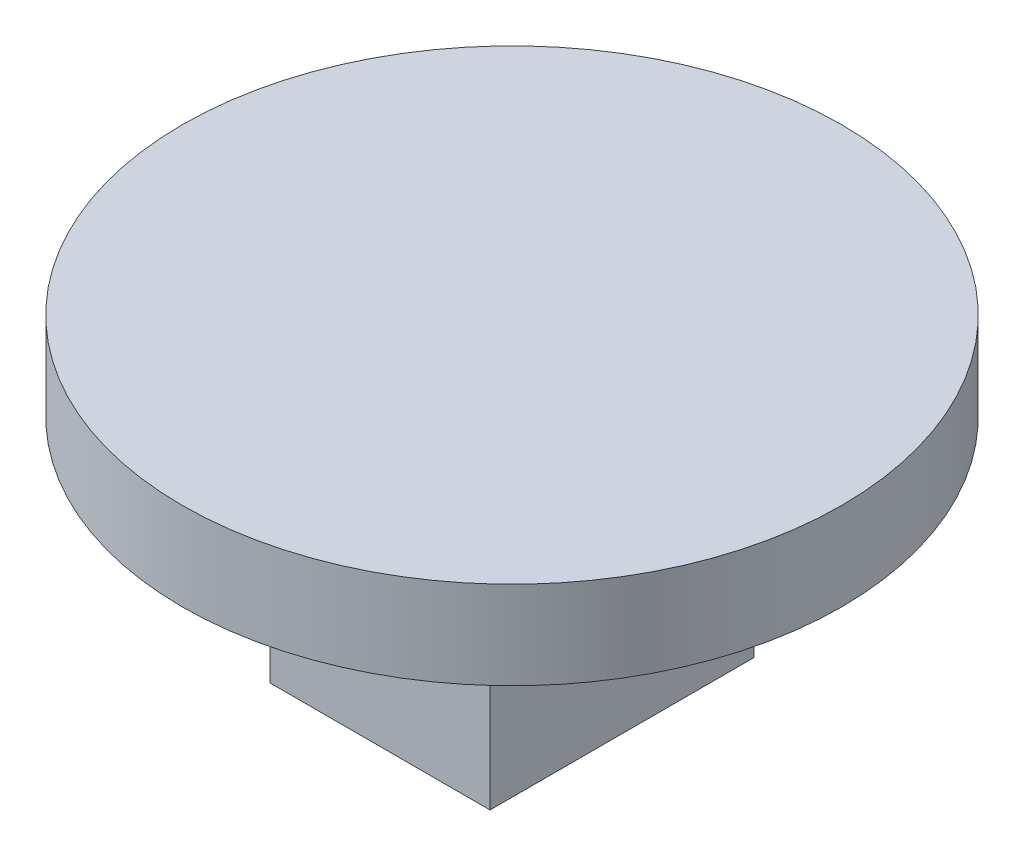
ISO-10303-21;
HEADER;
FILE_DESCRIPTION(('STEP AP214'),'2;1');
FILE_NAME('part.step','',(''),(''),'','','');
FILE_SCHEMA(('AUTOMOTIVE_DESIGN { 1 0 10303 214 1 1 1 1 }'));
ENDSEC;
DATA;
#1=APPLICATION_CONTEXT('core data for automotive mechanical design processes');
#2=APPLICATION_PROTOCOL_DEFINITION('international standard','automotive_design',2000,#1);
#3=PRODUCT_CONTEXT('',#1,'mechanical');
#4=PRODUCT('Part','Part','',(#3));
#5=PRODUCT_RELATED_PRODUCT_CATEGORY('part','',(#4));
#6=PRODUCT_DEFINITION_FORMATION('','',#4);
#7=PRODUCT_DEFINITION_CONTEXT('part definition',#1,'design');
#8=PRODUCT_DEFINITION('design','',#6,#7);
#9=PRODUCT_DEFINITION_SHAPE('','',#8);
#10=(LENGTH_UNIT() NAMED_UNIT(*) SI_UNIT(.MILLI.,.METRE.));
#11=(NAMED_UNIT(*) PLANE_ANGLE_UNIT() SI_UNIT($,.RADIAN.));
#12=(NAMED_UNIT(*) SI_UNIT($,.STERADIAN.) SOLID_ANGLE_UNIT());
#13=UNCERTAINTY_MEASURE_WITH_UNIT(LENGTH_MEASURE(1.E-05),#10,'distance_accuracy_value','');
#14=(GEOMETRIC_REPRESENTATION_CONTEXT(3) GLOBAL_UNCERTAINTY_ASSIGNED_CONTEXT((#13)) GLOBAL_UNIT_ASSIGNED_CONTEXT((#10,
#11,#12)) REPRESENTATION_CONTEXT('',''));
#15=CARTESIAN_POINT('',(0.,0.,0.));
#16=DIRECTION('',(0.,0.,1.));
#17=DIRECTION('',(1.,0.,0.));
#18=AXIS2_PLACEMENT_3D('',#15,#16,#17);
#19=CARTESIAN_POINT('',(0.,5.,0.));
#20=DIRECTION('',(1.,0.,0.));
#21=DIRECTION('',(0.,0.,-1.));
#22=AXIS2_PLACEMENT_3D('',#19,#20,#21);
#23=PLANE('',#22);
#24=DIRECTION('',(0.,0.,1.));
#25=VECTOR('',#24,1.);
#26=CARTESIAN_POINT('',(0.,0.,0.));
#27=LINE('',#26,#25);
#28=CARTESIAN_POINT('',(0.,0.,-6.));
#29=VERTEX_POINT('',#28);
#30=CARTESIAN_POINT('',(0.,0.,0.));
#31=VERTEX_POINT('',#30);
#32=EDGE_CURVE('E143',#29,#31,#27,.T.);
#33=ORIENTED_EDGE('',*,*,#32,.T.);
#34=DIRECTION('',(0.,-1.,0.));
#35=VECTOR('',#34,1.);
#36=CARTESIAN_POINT('',(0.,5.,0.));
#37=LINE('',#36,#35);
#38=CARTESIAN_POINT('',(0.,5.,0.));
#39=VERTEX_POINT('',#38);
#40=EDGE_CURVE('E11',#39,#31,#37,.T.);
#41=ORIENTED_EDGE('',*,*,#40,.F.);
#42=DIRECTION('',(0.,0.,1.));
#43=VECTOR('',#42,1.);
#44=CARTESIAN_POINT('',(0.,5.,0.));
#45=LINE('',#44,#43);
#46=CARTESIAN_POINT('',(0.,5.,-6.));
#47=VERTEX_POINT('',#46);
#48=EDGE_CURVE('E112',#47,#39,#45,.T.);
#49=ORIENTED_EDGE('',*,*,#48,.F.);
#50=DIRECTION('',(0.,-1.,0.));
#51=VECTOR('',#50,1.);
#52=CARTESIAN_POINT('',(0.,5.,-6.));
#53=LINE('',#52,#51);
#54=EDGE_CURVE('E115',#47,#29,#53,.T.);
#55=ORIENTED_EDGE('',*,*,#54,.T.);
#56=EDGE_LOOP('',(#33,#41,#49,#55));
#57=FACE_BOUND('',#56,.T.);
#58=ADVANCED_FACE('F45',(#57),#23,.F.);
#59=CARTESIAN_POINT('',(0.,5.,0.));
#60=DIRECTION('',(0.,0.,-1.));
#61=DIRECTION('',(-1.,0.,0.));
#62=AXIS2_PLACEMENT_3D('',#59,#60,#61);
#63=PLANE('',#62);
#64=DIRECTION('',(1.,0.,0.));
#65=VECTOR('',#64,1.);
#66=CARTESIAN_POINT('',(0.,0.,0.));
#67=LINE('',#66,#65);
#68=CARTESIAN_POINT('',(5.,0.,0.));
#69=VERTEX_POINT('',#68);
#70=EDGE_CURVE('E146',#31,#69,#67,.T.);
#71=ORIENTED_EDGE('',*,*,#70,.T.);
#72=DIRECTION('',(0.,-1.,0.));
#73=VECTOR('',#72,1.);
#74=CARTESIAN_POINT('',(5.,5.,0.));
#75=LINE('',#74,#73);
#76=CARTESIAN_POINT('',(5.,5.,0.));
#77=VERTEX_POINT('',#76);
#78=EDGE_CURVE('E53',#77,#69,#75,.T.);
#79=ORIENTED_EDGE('',*,*,#78,.F.);
#80=DIRECTION('',(1.,0.,0.));
#81=VECTOR('',#80,1.);
#82=CARTESIAN_POINT('',(0.,5.,0.));
#83=LINE('',#82,#81);
#84=EDGE_CURVE('E121',#39,#77,#83,.T.);
#85=ORIENTED_EDGE('',*,*,#84,.F.);
#86=ORIENTED_EDGE('',*,*,#40,.T.);
#87=EDGE_LOOP('',(#71,#79,#85,#86));
#88=FACE_BOUND('',#87,.T.);
#89=ADVANCED_FACE('F164',(#88),#63,.F.);
#90=CARTESIAN_POINT('',(5.,5.,0.));
#91=DIRECTION('',(-1.,0.,0.));
#92=DIRECTION('',(0.,0.,1.));
#93=AXIS2_PLACEMENT_3D('',#90,#91,#92);
#94=PLANE('',#93);
#95=DIRECTION('',(0.,0.,-1.));
#96=VECTOR('',#95,1.);
#97=CARTESIAN_POINT('',(5.,0.,0.));
#98=LINE('',#97,#96);
#99=CARTESIAN_POINT('',(5.,0.,-6.));
#100=VERTEX_POINT('',#99);
#101=EDGE_CURVE('E150',#69,#100,#98,.T.);
#102=ORIENTED_EDGE('',*,*,#101,.T.);
#103=DIRECTION('',(0.,-1.,0.));
#104=VECTOR('',#103,1.);
#105=CARTESIAN_POINT('',(5.,5.,-6.));
#106=LINE('',#105,#104);
#107=CARTESIAN_POINT('',(5.,5.,-6.));
#108=VERTEX_POINT('',#107);
#109=EDGE_CURVE('E132',#108,#100,#106,.T.);
#110=ORIENTED_EDGE('',*,*,#109,.F.);
#111=DIRECTION('',(0.,0.,-1.));
#112=VECTOR('',#111,1.);
#113=CARTESIAN_POINT('',(5.,5.,0.));
#114=LINE('',#113,#112);
#115=EDGE_CURVE('E136',#77,#108,#114,.T.);
#116=ORIENTED_EDGE('',*,*,#115,.F.);
#117=ORIENTED_EDGE('',*,*,#78,.T.);
#118=EDGE_LOOP('',(#102,#110,#116,#117));
#119=FACE_BOUND('',#118,.T.);
#120=ADVANCED_FACE('F160',(#119),#94,.F.);
#121=CARTESIAN_POINT('',(0.,5.,-6.));
#122=DIRECTION('',(0.,0.,1.));
#123=DIRECTION('',(1.,0.,0.));
#124=AXIS2_PLACEMENT_3D('',#121,#122,#123);
#125=PLANE('',#124);
#126=DIRECTION('',(-1.,0.,0.));
#127=VECTOR('',#126,1.);
#128=CARTESIAN_POINT('',(0.,0.,-6.));
#129=LINE('',#128,#127);
#130=EDGE_CURVE('E122',#100,#29,#129,.T.);
#131=ORIENTED_EDGE('',*,*,#130,.T.);
#132=ORIENTED_EDGE('',*,*,#54,.F.);
#133=DIRECTION('',(-1.,0.,0.));
#134=VECTOR('',#133,1.);
#135=CARTESIAN_POINT('',(0.,5.,-6.));
#136=LINE('',#135,#134);
#137=EDGE_CURVE('E128',#108,#47,#136,.T.);
#138=ORIENTED_EDGE('',*,*,#137,.F.);
#139=ORIENTED_EDGE('',*,*,#109,.T.);
#140=EDGE_LOOP('',(#131,#132,#138,#139));
#141=FACE_BOUND('',#140,.T.);
#142=ADVANCED_FACE('F126',(#141),#125,.F.);
#143=CARTESIAN_POINT('',(0.,0.,0.));
#144=DIRECTION('',(0.,-1.,0.));
#145=DIRECTION('',(0.,0.,-1.));
#146=AXIS2_PLACEMENT_3D('',#143,#144,#145);
#147=PLANE('',#146);
#148=DIRECTION('',(0.,0.,-1.));
#149=VECTOR('',#148,1.);
#150=CARTESIAN_POINT('',(0.875,0.,-0.875));
#151=LINE('',#150,#149);
#152=CARTESIAN_POINT('',(0.875,0.,-0.875));
#153=VERTEX_POINT('',#152);
#154=CARTESIAN_POINT('',(0.875,0.,-5.125));
#155=VERTEX_POINT('',#154);
#156=EDGE_CURVE('E68',#153,#155,#151,.T.);
#157=ORIENTED_EDGE('',*,*,#156,.F.);
#158=DIRECTION('',(-1.,0.,0.));
#159=VECTOR('',#158,1.);
#160=CARTESIAN_POINT('',(0.875,0.,-0.875));
#161=LINE('',#160,#159);
#162=CARTESIAN_POINT('',(4.125,0.,-0.875));
#163=VERTEX_POINT('',#162);
#164=EDGE_CURVE('E179',#163,#153,#161,.T.);
#165=ORIENTED_EDGE('',*,*,#164,.F.);
#166=DIRECTION('',(0.,0.,1.));
#167=VECTOR('',#166,1.);
#168=CARTESIAN_POINT('',(4.125,0.,-0.875));
#169=LINE('',#168,#167);
#170=CARTESIAN_POINT('',(4.125,0.,-5.125));
#171=VERTEX_POINT('',#170);
#172=EDGE_CURVE('E184',#171,#163,#169,.T.);
#173=ORIENTED_EDGE('',*,*,#172,.F.);
#174=DIRECTION('',(1.,0.,0.));
#175=VECTOR('',#174,1.);
#176=CARTESIAN_POINT('',(0.875,0.,-5.125));
#177=LINE('',#176,#175);
#178=EDGE_CURVE('E188',#155,#171,#177,.T.);
#179=ORIENTED_EDGE('',*,*,#178,.F.);
#180=EDGE_LOOP('',(#157,#165,#173,#179));
#181=FACE_BOUND('',#180,.T.);
#182=ORIENTED_EDGE('',*,*,#32,.F.);
#183=ORIENTED_EDGE('',*,*,#130,.F.);
#184=ORIENTED_EDGE('',*,*,#101,.F.);
#185=ORIENTED_EDGE('',*,*,#70,.F.);
#186=EDGE_LOOP('',(#182,#183,#184,#185));
#187=FACE_BOUND('',#186,.T.);
#188=ADVANCED_FACE('F163',(#181,#187),#147,.T.);
#189=CARTESIAN_POINT('',(0.875,5.,-0.875));
#190=DIRECTION('',(-1.,0.,0.));
#191=DIRECTION('',(0.,0.,1.));
#192=AXIS2_PLACEMENT_3D('',#189,#190,#191);
#193=PLANE('',#192);
#194=ORIENTED_EDGE('',*,*,#156,.T.);
#195=DIRECTION('',(0.,-1.,0.));
#196=VECTOR('',#195,1.);
#197=CARTESIAN_POINT('',(0.875,5.,-5.125));
#198=LINE('',#197,#196);
#199=CARTESIAN_POINT('',(0.875,5.,-5.125));
#200=VERTEX_POINT('',#199);
#201=EDGE_CURVE('E167',#200,#155,#198,.T.);
#202=ORIENTED_EDGE('',*,*,#201,.F.);
#203=DIRECTION('',(0.,0.,-1.));
#204=VECTOR('',#203,1.);
#205=CARTESIAN_POINT('',(0.875,5.,-0.875));
#206=LINE('',#205,#204);
#207=CARTESIAN_POINT('',(0.875,5.,-0.875));
#208=VERTEX_POINT('',#207);
#209=EDGE_CURVE('E183',#208,#200,#206,.T.);
#210=ORIENTED_EDGE('',*,*,#209,.F.);
#211=DIRECTION('',(0.,-1.,0.));
#212=VECTOR('',#211,1.);
#213=CARTESIAN_POINT('',(0.875,5.,-0.875));
#214=LINE('',#213,#212);
#215=EDGE_CURVE('E147',#208,#153,#214,.T.);
#216=ORIENTED_EDGE('',*,*,#215,.T.);
#217=EDGE_LOOP('',(#194,#202,#210,#216));
#218=FACE_BOUND('',#217,.T.);
#219=ADVANCED_FACE('F244',(#218),#193,.F.);
#220=CARTESIAN_POINT('',(0.875,5.,-0.875));
#221=DIRECTION('',(0.,0.,1.));
#222=DIRECTION('',(1.,0.,0.));
#223=AXIS2_PLACEMENT_3D('',#220,#221,#222);
#224=PLANE('',#223);
#225=ORIENTED_EDGE('',*,*,#164,.T.);
#226=ORIENTED_EDGE('',*,*,#215,.F.);
#227=DIRECTION('',(-1.,0.,0.));
#228=VECTOR('',#227,1.);
#229=CARTESIAN_POINT('',(0.875,5.,-0.875));
#230=LINE('',#229,#228);
#231=CARTESIAN_POINT('',(4.125,5.,-0.875));
#232=VERTEX_POINT('',#231);
#233=EDGE_CURVE('E171',#232,#208,#230,.T.);
#234=ORIENTED_EDGE('',*,*,#233,.F.);
#235=DIRECTION('',(0.,-1.,0.));
#236=VECTOR('',#235,1.);
#237=CARTESIAN_POINT('',(4.125,5.,-0.875));
#238=LINE('',#237,#236);
#239=EDGE_CURVE('E174',#232,#163,#238,.T.);
#240=ORIENTED_EDGE('',*,*,#239,.T.);
#241=EDGE_LOOP('',(#225,#226,#234,#240));
#242=FACE_BOUND('',#241,.T.);
#243=ADVANCED_FACE('F248',(#242),#224,.F.);
#244=CARTESIAN_POINT('',(4.125,5.,-0.875));
#245=DIRECTION('',(1.,0.,0.));
#246=DIRECTION('',(0.,0.,-1.));
#247=AXIS2_PLACEMENT_3D('',#244,#245,#246);
#248=PLANE('',#247);
#249=ORIENTED_EDGE('',*,*,#172,.T.);
#250=ORIENTED_EDGE('',*,*,#239,.F.);
#251=DIRECTION('',(0.,0.,1.));
#252=VECTOR('',#251,1.);
#253=CARTESIAN_POINT('',(4.125,5.,-0.875));
#254=LINE('',#253,#252);
#255=CARTESIAN_POINT('',(4.125,5.,-5.125));
#256=VERTEX_POINT('',#255);
#257=EDGE_CURVE('E60',#256,#232,#254,.T.);
#258=ORIENTED_EDGE('',*,*,#257,.F.);
#259=DIRECTION('',(0.,-1.,0.));
#260=VECTOR('',#259,1.);
#261=CARTESIAN_POINT('',(4.125,5.,-5.125));
#262=LINE('',#261,#260);
#263=EDGE_CURVE('E170',#256,#171,#262,.T.);
#264=ORIENTED_EDGE('',*,*,#263,.T.);
#265=EDGE_LOOP('',(#249,#250,#258,#264));
#266=FACE_BOUND('',#265,.T.);
#267=ADVANCED_FACE('F252',(#266),#248,.F.);
#268=CARTESIAN_POINT('',(0.875,5.,-5.125));
#269=DIRECTION('',(0.,0.,-1.));
#270=DIRECTION('',(-1.,0.,0.));
#271=AXIS2_PLACEMENT_3D('',#268,#269,#270);
#272=PLANE('',#271);
#273=ORIENTED_EDGE('',*,*,#178,.T.);
#274=ORIENTED_EDGE('',*,*,#263,.F.);
#275=DIRECTION('',(1.,0.,0.));
#276=VECTOR('',#275,1.);
#277=CARTESIAN_POINT('',(0.875,5.,-5.125));
#278=LINE('',#277,#276);
#279=EDGE_CURVE('E200',#200,#256,#278,.T.);
#280=ORIENTED_EDGE('',*,*,#279,.F.);
#281=ORIENTED_EDGE('',*,*,#201,.T.);
#282=EDGE_LOOP('',(#273,#274,#280,#281));
#283=FACE_BOUND('',#282,.T.);
#284=ADVANCED_FACE('F249',(#283),#272,.F.);
#285=CARTESIAN_POINT('',(2.5,7.,-3.));
#286=DIRECTION('',(0.,1.,0.));
#287=DIRECTION('',(0.,0.,1.));
#288=AXIS2_PLACEMENT_3D('',#285,#286,#287);
#289=PLANE('',#288);
#290=CARTESIAN_POINT('',(2.5,7.,-3.));
#291=DIRECTION('',(0.,1.,0.));
#292=DIRECTION('',(0.,0.,1.));
#293=AXIS2_PLACEMENT_3D('',#290,#291,#292);
#294=CIRCLE('',#293,7.5);
#295=CARTESIAN_POINT('',(2.5,7.,4.5));
#296=VERTEX_POINT('',#295);
#297=EDGE_CURVE('E194',#296,#296,#294,.T.);
#298=ORIENTED_EDGE('',*,*,#297,.T.);
#299=EDGE_LOOP('',(#298));
#300=FACE_BOUND('',#299,.T.);
#301=ADVANCED_FACE('F215',(#300),#289,.T.);
#302=CARTESIAN_POINT('',(2.5,7.,-3.));
#303=DIRECTION('',(0.,-1.,0.));
#304=DIRECTION('',(0.,0.,-1.));
#305=AXIS2_PLACEMENT_3D('',#302,#303,#304);
#306=CYLINDRICAL_SURFACE('',#305,7.5);
#307=ORIENTED_EDGE('',*,*,#297,.F.);
#308=EDGE_LOOP('',(#307));
#309=FACE_BOUND('',#308,.T.);
#310=CARTESIAN_POINT('',(2.5,5.,-3.));
#311=DIRECTION('',(0.,1.,0.));
#312=DIRECTION('',(0.,0.,1.));
#313=AXIS2_PLACEMENT_3D('',#310,#311,#312);
#314=CIRCLE('',#313,7.5);
#315=CARTESIAN_POINT('',(2.5,5.,4.5));
#316=VERTEX_POINT('',#315);
#317=EDGE_CURVE('E207',#316,#316,#314,.T.);
#318=ORIENTED_EDGE('',*,*,#317,.T.);
#319=EDGE_LOOP('',(#318));
#320=FACE_BOUND('',#319,.T.);
#321=ADVANCED_FACE('F217',(#309,#320),#306,.T.);
#322=CARTESIAN_POINT('',(2.5,5.,-3.));
#323=DIRECTION('',(0.,1.,0.));
#324=DIRECTION('',(0.,0.,1.));
#325=AXIS2_PLACEMENT_3D('',#322,#323,#324);
#326=PLANE('',#325);
#327=ORIENTED_EDGE('',*,*,#317,.F.);
#328=EDGE_LOOP('',(#327));
#329=FACE_BOUND('',#328,.T.);
#330=ORIENTED_EDGE('',*,*,#137,.T.);
#331=ORIENTED_EDGE('',*,*,#48,.T.);
#332=ORIENTED_EDGE('',*,*,#84,.T.);
#333=ORIENTED_EDGE('',*,*,#115,.T.);
#334=EDGE_LOOP('',(#330,#331,#332,#333));
#335=FACE_BOUND('',#334,.T.);
#336=ADVANCED_FACE('F134',(#329,#335),#326,.F.);
#337=ORIENTED_EDGE('',*,*,#257,.T.);
#338=ORIENTED_EDGE('',*,*,#233,.T.);
#339=ORIENTED_EDGE('',*,*,#209,.T.);
#340=ORIENTED_EDGE('',*,*,#279,.T.);
#341=EDGE_LOOP('',(#337,#338,#339,#340));
#342=FACE_BOUND('',#341,.T.);
#343=ADVANCED_FACE('F224',(#342),#326,.F.);
#344=CLOSED_SHELL('',(#58,#89,#120,#142,#188,#219,#243,#267,#284,#301,#321,#336,#343));
#345=MANIFOLD_SOLID_BREP('B2',#344);
#346=ADVANCED_BREP_SHAPE_REPRESENTATION('',(#18,#345),#14);
#347=SHAPE_DEFINITION_REPRESENTATION(#9,#346);
ENDSEC;
END-ISO-10303-21;
